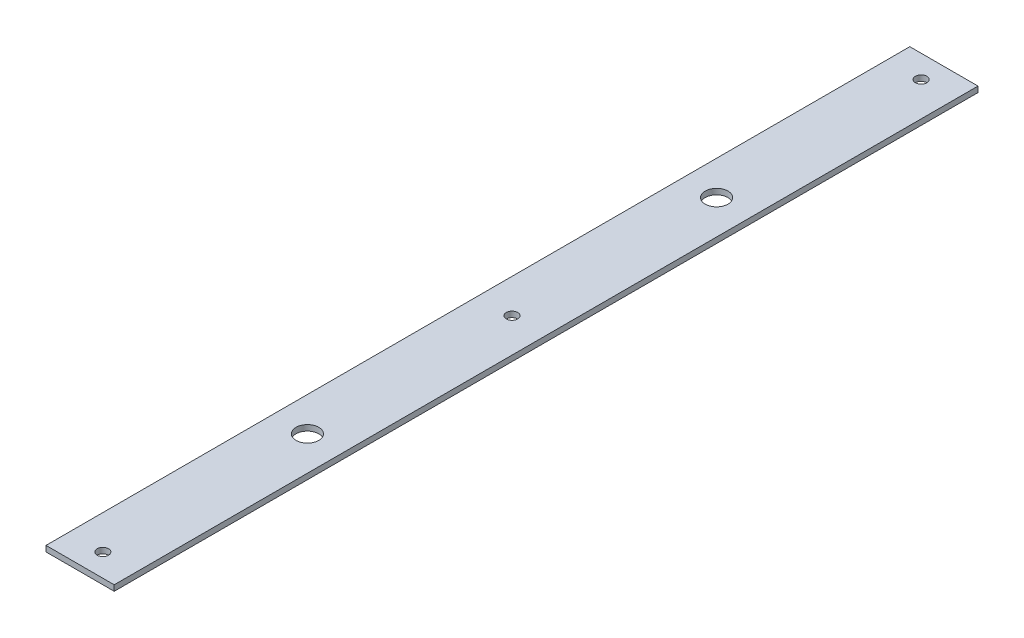
ISO-10303-21;
HEADER;
FILE_DESCRIPTION(('STEP AP214'),'2;1');
FILE_NAME('part.step','',(''),(''),'','','');
FILE_SCHEMA(('AUTOMOTIVE_DESIGN { 1 0 10303 214 1 1 1 1 }'));
ENDSEC;
DATA;
#1=APPLICATION_CONTEXT('core data for automotive mechanical design processes');
#2=APPLICATION_PROTOCOL_DEFINITION('international standard','automotive_design',2000,#1);
#3=PRODUCT_CONTEXT('',#1,'mechanical');
#4=PRODUCT('Part','Part','',(#3));
#5=PRODUCT_RELATED_PRODUCT_CATEGORY('part','',(#4));
#6=PRODUCT_DEFINITION_FORMATION('','',#4);
#7=PRODUCT_DEFINITION_CONTEXT('part definition',#1,'design');
#8=PRODUCT_DEFINITION('design','',#6,#7);
#9=PRODUCT_DEFINITION_SHAPE('','',#8);
#10=(LENGTH_UNIT() NAMED_UNIT(*) SI_UNIT(.MILLI.,.METRE.));
#11=(NAMED_UNIT(*) PLANE_ANGLE_UNIT() SI_UNIT($,.RADIAN.));
#12=(NAMED_UNIT(*) SI_UNIT($,.STERADIAN.) SOLID_ANGLE_UNIT());
#13=UNCERTAINTY_MEASURE_WITH_UNIT(LENGTH_MEASURE(1.E-05),#10,'distance_accuracy_value','');
#14=(GEOMETRIC_REPRESENTATION_CONTEXT(3) GLOBAL_UNCERTAINTY_ASSIGNED_CONTEXT((#13)) GLOBAL_UNIT_ASSIGNED_CONTEXT((#10,
#11,#12)) REPRESENTATION_CONTEXT('',''));
#15=CARTESIAN_POINT('',(0.,0.,0.));
#16=DIRECTION('',(0.,0.,1.));
#17=DIRECTION('',(1.,0.,0.));
#18=AXIS2_PLACEMENT_3D('',#15,#16,#17);
#19=CARTESIAN_POINT('',(19.05,3.175,-241.3));
#20=DIRECTION('',(-1.,0.,0.));
#21=DIRECTION('',(0.,0.,1.));
#22=AXIS2_PLACEMENT_3D('',#19,#20,#21);
#23=PLANE('',#22);
#24=DIRECTION('',(0.,0.,-1.));
#25=VECTOR('',#24,1.);
#26=CARTESIAN_POINT('',(19.05,0.,-241.3));
#27=LINE('',#26,#25);
#28=CARTESIAN_POINT('',(19.05,0.,241.3));
#29=VERTEX_POINT('',#28);
#30=CARTESIAN_POINT('',(19.05,0.,-241.3));
#31=VERTEX_POINT('',#30);
#32=EDGE_CURVE('E95',#29,#31,#27,.T.);
#33=ORIENTED_EDGE('',*,*,#32,.T.);
#34=DIRECTION('',(0.,-1.,0.));
#35=VECTOR('',#34,1.);
#36=CARTESIAN_POINT('',(19.05,3.175,-241.3));
#37=LINE('',#36,#35);
#38=CARTESIAN_POINT('',(19.05,3.175,-241.3));
#39=VERTEX_POINT('',#38);
#40=EDGE_CURVE('E11',#39,#31,#37,.T.);
#41=ORIENTED_EDGE('',*,*,#40,.F.);
#42=DIRECTION('',(0.,0.,-1.));
#43=VECTOR('',#42,1.);
#44=CARTESIAN_POINT('',(19.05,3.175,-241.3));
#45=LINE('',#44,#43);
#46=CARTESIAN_POINT('',(19.05,3.175,241.3));
#47=VERTEX_POINT('',#46);
#48=EDGE_CURVE('E83',#47,#39,#45,.T.);
#49=ORIENTED_EDGE('',*,*,#48,.F.);
#50=DIRECTION('',(0.,-1.,0.));
#51=VECTOR('',#50,1.);
#52=CARTESIAN_POINT('',(19.05,3.175,241.3));
#53=LINE('',#52,#51);
#54=EDGE_CURVE('E91',#47,#29,#53,.T.);
#55=ORIENTED_EDGE('',*,*,#54,.T.);
#56=EDGE_LOOP('',(#33,#41,#49,#55));
#57=FACE_BOUND('',#56,.T.);
#58=ADVANCED_FACE('F32',(#57),#23,.F.);
#59=CARTESIAN_POINT('',(-19.05,3.175,-241.3));
#60=DIRECTION('',(0.,0.,1.));
#61=DIRECTION('',(1.,0.,0.));
#62=AXIS2_PLACEMENT_3D('',#59,#60,#61);
#63=PLANE('',#62);
#64=DIRECTION('',(-1.,0.,0.));
#65=VECTOR('',#64,1.);
#66=CARTESIAN_POINT('',(-19.05,0.,-241.3));
#67=LINE('',#66,#65);
#68=CARTESIAN_POINT('',(-19.05,0.,-241.3));
#69=VERTEX_POINT('',#68);
#70=EDGE_CURVE('E87',#31,#69,#67,.T.);
#71=ORIENTED_EDGE('',*,*,#70,.T.);
#72=DIRECTION('',(0.,-1.,0.));
#73=VECTOR('',#72,1.);
#74=CARTESIAN_POINT('',(-19.05,3.175,-241.3));
#75=LINE('',#74,#73);
#76=CARTESIAN_POINT('',(-19.05,3.175,-241.3));
#77=VERTEX_POINT('',#76);
#78=EDGE_CURVE('E40',#77,#69,#75,.T.);
#79=ORIENTED_EDGE('',*,*,#78,.F.);
#80=DIRECTION('',(-1.,0.,0.));
#81=VECTOR('',#80,1.);
#82=CARTESIAN_POINT('',(-19.05,3.175,-241.3));
#83=LINE('',#82,#81);
#84=EDGE_CURVE('E78',#39,#77,#83,.T.);
#85=ORIENTED_EDGE('',*,*,#84,.F.);
#86=ORIENTED_EDGE('',*,*,#40,.T.);
#87=EDGE_LOOP('',(#71,#79,#85,#86));
#88=FACE_BOUND('',#87,.T.);
#89=ADVANCED_FACE('F86',(#88),#63,.F.);
#90=CARTESIAN_POINT('',(-19.05,3.175,241.3));
#91=DIRECTION('',(1.,0.,0.));
#92=DIRECTION('',(0.,0.,-1.));
#93=AXIS2_PLACEMENT_3D('',#90,#91,#92);
#94=PLANE('',#93);
#95=DIRECTION('',(0.,0.,1.));
#96=VECTOR('',#95,1.);
#97=CARTESIAN_POINT('',(-19.05,0.,241.3));
#98=LINE('',#97,#96);
#99=CARTESIAN_POINT('',(-19.05,0.,241.3));
#100=VERTEX_POINT('',#99);
#101=EDGE_CURVE('E65',#69,#100,#98,.T.);
#102=ORIENTED_EDGE('',*,*,#101,.T.);
#103=DIRECTION('',(0.,-1.,0.));
#104=VECTOR('',#103,1.);
#105=CARTESIAN_POINT('',(-19.05,3.175,241.3));
#106=LINE('',#105,#104);
#107=CARTESIAN_POINT('',(-19.05,3.175,241.3));
#108=VERTEX_POINT('',#107);
#109=EDGE_CURVE('E88',#108,#100,#106,.T.);
#110=ORIENTED_EDGE('',*,*,#109,.F.);
#111=DIRECTION('',(0.,0.,1.));
#112=VECTOR('',#111,1.);
#113=CARTESIAN_POINT('',(-19.05,3.175,241.3));
#114=LINE('',#113,#112);
#115=EDGE_CURVE('E81',#77,#108,#114,.T.);
#116=ORIENTED_EDGE('',*,*,#115,.F.);
#117=ORIENTED_EDGE('',*,*,#78,.T.);
#118=EDGE_LOOP('',(#102,#110,#116,#117));
#119=FACE_BOUND('',#118,.T.);
#120=ADVANCED_FACE('F89',(#119),#94,.F.);
#121=CARTESIAN_POINT('',(19.05,3.175,241.3));
#122=DIRECTION('',(0.,0.,-1.));
#123=DIRECTION('',(-1.,0.,0.));
#124=AXIS2_PLACEMENT_3D('',#121,#122,#123);
#125=PLANE('',#124);
#126=DIRECTION('',(1.,0.,0.));
#127=VECTOR('',#126,1.);
#128=CARTESIAN_POINT('',(19.05,0.,241.3));
#129=LINE('',#128,#127);
#130=EDGE_CURVE('E71',#100,#29,#129,.T.);
#131=ORIENTED_EDGE('',*,*,#130,.T.);
#132=ORIENTED_EDGE('',*,*,#54,.F.);
#133=DIRECTION('',(1.,0.,0.));
#134=VECTOR('',#133,1.);
#135=CARTESIAN_POINT('',(19.05,3.175,241.3));
#136=LINE('',#135,#134);
#137=EDGE_CURVE('E48',#108,#47,#136,.T.);
#138=ORIENTED_EDGE('',*,*,#137,.F.);
#139=ORIENTED_EDGE('',*,*,#109,.T.);
#140=EDGE_LOOP('',(#131,#132,#138,#139));
#141=FACE_BOUND('',#140,.T.);
#142=ADVANCED_FACE('F103',(#141),#125,.F.);
#143=CARTESIAN_POINT('',(0.,3.175,0.));
#144=DIRECTION('',(0.,-1.,0.));
#145=DIRECTION('',(0.,0.,-1.));
#146=AXIS2_PLACEMENT_3D('',#143,#144,#145);
#147=PLANE('',#146);
#148=CARTESIAN_POINT('',(0.,3.175,-114.3));
#149=DIRECTION('',(0.,1.,0.));
#150=DIRECTION('',(0.,0.,1.));
#151=AXIS2_PLACEMENT_3D('',#148,#149,#150);
#152=CIRCLE('',#151,6.35000000000001);
#153=CARTESIAN_POINT('',(0.,3.175,-107.95));
#154=VERTEX_POINT('',#153);
#155=EDGE_CURVE('E135',#154,#154,#152,.T.);
#156=ORIENTED_EDGE('',*,*,#155,.F.);
#157=EDGE_LOOP('',(#156));
#158=FACE_BOUND('',#157,.T.);
#159=CARTESIAN_POINT('',(0.,3.175,114.3));
#160=DIRECTION('',(0.,1.,0.));
#161=DIRECTION('',(0.,0.,1.));
#162=AXIS2_PLACEMENT_3D('',#159,#160,#161);
#163=CIRCLE('',#162,6.35000000000001);
#164=CARTESIAN_POINT('',(0.,3.175,120.65));
#165=VERTEX_POINT('',#164);
#166=EDGE_CURVE('E129',#165,#165,#163,.T.);
#167=ORIENTED_EDGE('',*,*,#166,.F.);
#168=EDGE_LOOP('',(#167));
#169=FACE_BOUND('',#168,.T.);
#170=CARTESIAN_POINT('',(0.,3.175,228.6));
#171=DIRECTION('',(0.,1.,0.));
#172=DIRECTION('',(0.,0.,1.));
#173=AXIS2_PLACEMENT_3D('',#170,#171,#172);
#174=CIRCLE('',#173,3.17500000000001);
#175=CARTESIAN_POINT('',(0.,3.175,231.775));
#176=VERTEX_POINT('',#175);
#177=EDGE_CURVE('E123',#176,#176,#174,.T.);
#178=ORIENTED_EDGE('',*,*,#177,.F.);
#179=EDGE_LOOP('',(#178));
#180=FACE_BOUND('',#179,.T.);
#181=CARTESIAN_POINT('',(0.,3.175,-228.6));
#182=DIRECTION('',(0.,1.,0.));
#183=DIRECTION('',(0.,0.,1.));
#184=AXIS2_PLACEMENT_3D('',#181,#182,#183);
#185=CIRCLE('',#184,3.17500000000001);
#186=CARTESIAN_POINT('',(0.,3.175,-225.425));
#187=VERTEX_POINT('',#186);
#188=EDGE_CURVE('E117',#187,#187,#185,.T.);
#189=ORIENTED_EDGE('',*,*,#188,.F.);
#190=EDGE_LOOP('',(#189));
#191=FACE_BOUND('',#190,.T.);
#192=CARTESIAN_POINT('',(0.,3.175,0.));
#193=DIRECTION('',(0.,1.,0.));
#194=DIRECTION('',(0.,0.,1.));
#195=AXIS2_PLACEMENT_3D('',#192,#193,#194);
#196=CIRCLE('',#195,3.17500000000001);
#197=CARTESIAN_POINT('',(0.,3.175,3.17500000000001));
#198=VERTEX_POINT('',#197);
#199=EDGE_CURVE('E111',#198,#198,#196,.T.);
#200=ORIENTED_EDGE('',*,*,#199,.F.);
#201=EDGE_LOOP('',(#200));
#202=FACE_BOUND('',#201,.T.);
#203=ORIENTED_EDGE('',*,*,#48,.T.);
#204=ORIENTED_EDGE('',*,*,#84,.T.);
#205=ORIENTED_EDGE('',*,*,#115,.T.);
#206=ORIENTED_EDGE('',*,*,#137,.T.);
#207=EDGE_LOOP('',(#203,#204,#205,#206));
#208=FACE_BOUND('',#207,.T.);
#209=ADVANCED_FACE('F79',(#158,#169,#180,#191,#202,#208),#147,.F.);
#210=CARTESIAN_POINT('',(0.,0.,0.));
#211=DIRECTION('',(0.,-1.,0.));
#212=DIRECTION('',(0.,0.,-1.));
#213=AXIS2_PLACEMENT_3D('',#210,#211,#212);
#214=PLANE('',#213);
#215=CARTESIAN_POINT('',(0.,0.,-114.3));
#216=DIRECTION('',(0.,1.,0.));
#217=DIRECTION('',(0.,0.,1.));
#218=AXIS2_PLACEMENT_3D('',#215,#216,#217);
#219=CIRCLE('',#218,6.35000000000001);
#220=CARTESIAN_POINT('',(0.,0.,-107.95));
#221=VERTEX_POINT('',#220);
#222=EDGE_CURVE('E132',#221,#221,#219,.T.);
#223=ORIENTED_EDGE('',*,*,#222,.T.);
#224=EDGE_LOOP('',(#223));
#225=FACE_BOUND('',#224,.T.);
#226=CARTESIAN_POINT('',(0.,0.,114.3));
#227=DIRECTION('',(0.,1.,0.));
#228=DIRECTION('',(0.,0.,1.));
#229=AXIS2_PLACEMENT_3D('',#226,#227,#228);
#230=CIRCLE('',#229,6.35000000000001);
#231=CARTESIAN_POINT('',(0.,0.,120.65));
#232=VERTEX_POINT('',#231);
#233=EDGE_CURVE('E126',#232,#232,#230,.T.);
#234=ORIENTED_EDGE('',*,*,#233,.T.);
#235=EDGE_LOOP('',(#234));
#236=FACE_BOUND('',#235,.T.);
#237=CARTESIAN_POINT('',(0.,0.,228.6));
#238=DIRECTION('',(0.,1.,0.));
#239=DIRECTION('',(0.,0.,1.));
#240=AXIS2_PLACEMENT_3D('',#237,#238,#239);
#241=CIRCLE('',#240,3.17500000000001);
#242=CARTESIAN_POINT('',(0.,0.,231.775));
#243=VERTEX_POINT('',#242);
#244=EDGE_CURVE('E120',#243,#243,#241,.T.);
#245=ORIENTED_EDGE('',*,*,#244,.T.);
#246=EDGE_LOOP('',(#245));
#247=FACE_BOUND('',#246,.T.);
#248=CARTESIAN_POINT('',(0.,0.,-228.6));
#249=DIRECTION('',(0.,1.,0.));
#250=DIRECTION('',(0.,0.,1.));
#251=AXIS2_PLACEMENT_3D('',#248,#249,#250);
#252=CIRCLE('',#251,3.17500000000001);
#253=CARTESIAN_POINT('',(0.,0.,-225.425));
#254=VERTEX_POINT('',#253);
#255=EDGE_CURVE('E114',#254,#254,#252,.T.);
#256=ORIENTED_EDGE('',*,*,#255,.T.);
#257=EDGE_LOOP('',(#256));
#258=FACE_BOUND('',#257,.T.);
#259=CARTESIAN_POINT('',(0.,0.,0.));
#260=DIRECTION('',(0.,1.,0.));
#261=DIRECTION('',(0.,0.,1.));
#262=AXIS2_PLACEMENT_3D('',#259,#260,#261);
#263=CIRCLE('',#262,3.17500000000001);
#264=CARTESIAN_POINT('',(0.,0.,3.17500000000001));
#265=VERTEX_POINT('',#264);
#266=EDGE_CURVE('E98',#265,#265,#263,.T.);
#267=ORIENTED_EDGE('',*,*,#266,.T.);
#268=EDGE_LOOP('',(#267));
#269=FACE_BOUND('',#268,.T.);
#270=ORIENTED_EDGE('',*,*,#32,.F.);
#271=ORIENTED_EDGE('',*,*,#130,.F.);
#272=ORIENTED_EDGE('',*,*,#101,.F.);
#273=ORIENTED_EDGE('',*,*,#70,.F.);
#274=EDGE_LOOP('',(#270,#271,#272,#273));
#275=FACE_BOUND('',#274,.T.);
#276=ADVANCED_FACE('F106',(#225,#236,#247,#258,#269,#275),#214,.T.);
#277=CARTESIAN_POINT('',(0.,3.175,0.));
#278=DIRECTION('',(0.,1.,0.));
#279=DIRECTION('',(0.,0.,1.));
#280=AXIS2_PLACEMENT_3D('',#277,#278,#279);
#281=CYLINDRICAL_SURFACE('',#280,3.17500000000001);
#282=ORIENTED_EDGE('',*,*,#266,.F.);
#283=EDGE_LOOP('',(#282));
#284=FACE_BOUND('',#283,.T.);
#285=ORIENTED_EDGE('',*,*,#199,.T.);
#286=EDGE_LOOP('',(#285));
#287=FACE_BOUND('',#286,.T.);
#288=ADVANCED_FACE('F152',(#284,#287),#281,.F.);
#289=CARTESIAN_POINT('',(0.,3.175,-228.6));
#290=DIRECTION('',(0.,1.,0.));
#291=DIRECTION('',(0.,0.,1.));
#292=AXIS2_PLACEMENT_3D('',#289,#290,#291);
#293=CYLINDRICAL_SURFACE('',#292,3.17500000000001);
#294=ORIENTED_EDGE('',*,*,#255,.F.);
#295=EDGE_LOOP('',(#294));
#296=FACE_BOUND('',#295,.T.);
#297=ORIENTED_EDGE('',*,*,#188,.T.);
#298=EDGE_LOOP('',(#297));
#299=FACE_BOUND('',#298,.T.);
#300=ADVANCED_FACE('F154',(#296,#299),#293,.F.);
#301=CARTESIAN_POINT('',(0.,3.175,228.6));
#302=DIRECTION('',(0.,1.,0.));
#303=DIRECTION('',(0.,0.,1.));
#304=AXIS2_PLACEMENT_3D('',#301,#302,#303);
#305=CYLINDRICAL_SURFACE('',#304,3.17500000000001);
#306=ORIENTED_EDGE('',*,*,#244,.F.);
#307=EDGE_LOOP('',(#306));
#308=FACE_BOUND('',#307,.T.);
#309=ORIENTED_EDGE('',*,*,#177,.T.);
#310=EDGE_LOOP('',(#309));
#311=FACE_BOUND('',#310,.T.);
#312=ADVANCED_FACE('F161',(#308,#311),#305,.F.);
#313=CARTESIAN_POINT('',(0.,3.175,114.3));
#314=DIRECTION('',(0.,1.,0.));
#315=DIRECTION('',(0.,0.,1.));
#316=AXIS2_PLACEMENT_3D('',#313,#314,#315);
#317=CYLINDRICAL_SURFACE('',#316,6.35000000000001);
#318=ORIENTED_EDGE('',*,*,#233,.F.);
#319=EDGE_LOOP('',(#318));
#320=FACE_BOUND('',#319,.T.);
#321=ORIENTED_EDGE('',*,*,#166,.T.);
#322=EDGE_LOOP('',(#321));
#323=FACE_BOUND('',#322,.T.);
#324=ADVANCED_FACE('F227',(#320,#323),#317,.F.);
#325=CARTESIAN_POINT('',(0.,3.175,-114.3));
#326=DIRECTION('',(0.,1.,0.));
#327=DIRECTION('',(0.,0.,1.));
#328=AXIS2_PLACEMENT_3D('',#325,#326,#327);
#329=CYLINDRICAL_SURFACE('',#328,6.35000000000001);
#330=ORIENTED_EDGE('',*,*,#222,.F.);
#331=EDGE_LOOP('',(#330));
#332=FACE_BOUND('',#331,.T.);
#333=ORIENTED_EDGE('',*,*,#155,.T.);
#334=EDGE_LOOP('',(#333));
#335=FACE_BOUND('',#334,.T.);
#336=ADVANCED_FACE('F139',(#332,#335),#329,.F.);
#337=CLOSED_SHELL('',(#58,#89,#120,#142,#209,#276,#288,#300,#312,#324,#336));
#338=MANIFOLD_SOLID_BREP('B2',#337);
#339=ADVANCED_BREP_SHAPE_REPRESENTATION('',(#18,#338),#14);
#340=SHAPE_DEFINITION_REPRESENTATION(#9,#339);
ENDSEC;
END-ISO-10303-21;
